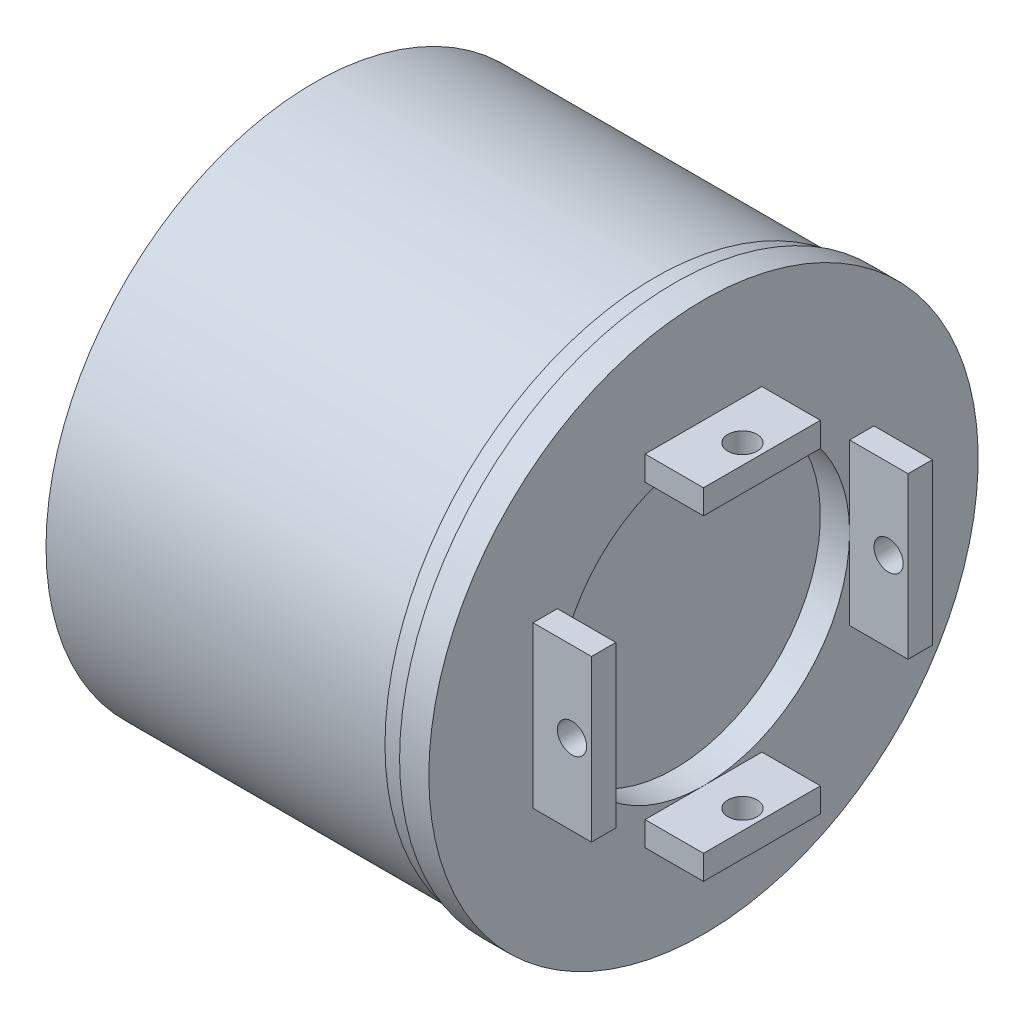
ISO-10303-21;
HEADER;
FILE_DESCRIPTION(('STEP AP214'),'2;1');
FILE_NAME('part.step','',(''),(''),'','','');
FILE_SCHEMA(('AUTOMOTIVE_DESIGN { 1 0 10303 214 1 1 1 1 }'));
ENDSEC;
DATA;
#1=APPLICATION_CONTEXT('core data for automotive mechanical design processes');
#2=APPLICATION_PROTOCOL_DEFINITION('international standard','automotive_design',2000,#1);
#3=PRODUCT_CONTEXT('',#1,'mechanical');
#4=PRODUCT('Part','Part','',(#3));
#5=PRODUCT_RELATED_PRODUCT_CATEGORY('part','',(#4));
#6=PRODUCT_DEFINITION_FORMATION('','',#4);
#7=PRODUCT_DEFINITION_CONTEXT('part definition',#1,'design');
#8=PRODUCT_DEFINITION('design','',#6,#7);
#9=PRODUCT_DEFINITION_SHAPE('','',#8);
#10=(LENGTH_UNIT() NAMED_UNIT(*) SI_UNIT(.MILLI.,.METRE.));
#11=(NAMED_UNIT(*) PLANE_ANGLE_UNIT() SI_UNIT($,.RADIAN.));
#12=(NAMED_UNIT(*) SI_UNIT($,.STERADIAN.) SOLID_ANGLE_UNIT());
#13=UNCERTAINTY_MEASURE_WITH_UNIT(LENGTH_MEASURE(1.E-05),#10,'distance_accuracy_value','');
#14=(GEOMETRIC_REPRESENTATION_CONTEXT(3) GLOBAL_UNCERTAINTY_ASSIGNED_CONTEXT((#13)) GLOBAL_UNIT_ASSIGNED_CONTEXT((#10,
#11,#12)) REPRESENTATION_CONTEXT('',''));
#15=CARTESIAN_POINT('',(0.,0.,0.));
#16=DIRECTION('',(0.,0.,1.));
#17=DIRECTION('',(1.,0.,0.));
#18=AXIS2_PLACEMENT_3D('',#15,#16,#17);
#19=CARTESIAN_POINT('',(41.,28.2,0.));
#20=DIRECTION('',(-1.,0.,0.));
#21=DIRECTION('',(0.,0.,1.));
#22=AXIS2_PLACEMENT_3D('',#19,#20,#21);
#23=PLANE('',#22);
#24=CARTESIAN_POINT('',(41.,0.,0.));
#25=DIRECTION('',(-1.,0.,0.));
#26=DIRECTION('',(0.,0.,1.));
#27=AXIS2_PLACEMENT_3D('',#24,#25,#26);
#28=CIRCLE('',#27,28.2);
#29=CARTESIAN_POINT('',(41.,0.,28.2));
#30=VERTEX_POINT('',#29);
#31=EDGE_CURVE('E333',#30,#30,#28,.T.);
#32=ORIENTED_EDGE('',*,*,#31,.F.);
#33=EDGE_LOOP('',(#32));
#34=FACE_BOUND('',#33,.T.);
#35=DIRECTION('',(0.,0.,1.));
#36=VECTOR('',#35,1.);
#37=CARTESIAN_POINT('',(41.,-15.,6.));
#38=LINE('',#37,#36);
#39=CARTESIAN_POINT('',(41.,-15.,-6.));
#40=VERTEX_POINT('',#39);
#41=CARTESIAN_POINT('',(41.,-15.,0.));
#42=VERTEX_POINT('',#41);
#43=EDGE_CURVE('E381',#40,#42,#38,.T.);
#44=ORIENTED_EDGE('',*,*,#43,.F.);
#45=DIRECTION('',(0.,1.,0.));
#46=VECTOR('',#45,1.);
#47=CARTESIAN_POINT('',(41.,-15.,-6.));
#48=LINE('',#47,#46);
#49=CARTESIAN_POINT('',(41.,-17.5,-6.));
#50=VERTEX_POINT('',#49);
#51=EDGE_CURVE('E184',#50,#40,#48,.T.);
#52=ORIENTED_EDGE('',*,*,#51,.F.);
#53=DIRECTION('',(0.,0.,-1.));
#54=VECTOR('',#53,1.);
#55=CARTESIAN_POINT('',(41.,-17.5,-6.));
#56=LINE('',#55,#54);
#57=CARTESIAN_POINT('',(41.,-17.5,6.));
#58=VERTEX_POINT('',#57);
#59=EDGE_CURVE('E62',#58,#50,#56,.T.);
#60=ORIENTED_EDGE('',*,*,#59,.F.);
#61=DIRECTION('',(0.,-1.,0.));
#62=VECTOR('',#61,1.);
#63=CARTESIAN_POINT('',(41.,-15.,6.));
#64=LINE('',#63,#62);
#65=CARTESIAN_POINT('',(41.,-15.,6.));
#66=VERTEX_POINT('',#65);
#67=EDGE_CURVE('E57',#66,#58,#64,.T.);
#68=ORIENTED_EDGE('',*,*,#67,.F.);
#69=EDGE_CURVE('E188',#42,#66,#38,.T.);
#70=ORIENTED_EDGE('',*,*,#69,.F.);
#71=CARTESIAN_POINT('',(41.,0.,0.));
#72=DIRECTION('',(-1.,0.,0.));
#73=DIRECTION('',(0.,0.,1.));
#74=AXIS2_PLACEMENT_3D('',#71,#72,#73);
#75=CIRCLE('',#74,15.);
#76=CARTESIAN_POINT('',(41.,0.,15.));
#77=VERTEX_POINT('',#76);
#78=EDGE_CURVE('E341',#42,#77,#75,.T.);
#79=ORIENTED_EDGE('',*,*,#78,.T.);
#80=DIRECTION('',(0.,1.,0.));
#81=VECTOR('',#80,1.);
#82=CARTESIAN_POINT('',(41.,8.25,15.));
#83=LINE('',#82,#81);
#84=CARTESIAN_POINT('',(41.,-8.25,15.));
#85=VERTEX_POINT('',#84);
#86=EDGE_CURVE('E192',#85,#77,#83,.T.);
#87=ORIENTED_EDGE('',*,*,#86,.F.);
#88=DIRECTION('',(0.,0.,-1.));
#89=VECTOR('',#88,1.);
#90=CARTESIAN_POINT('',(41.,-8.25,15.));
#91=LINE('',#90,#89);
#92=CARTESIAN_POINT('',(41.,-8.25,17.5));
#93=VERTEX_POINT('',#92);
#94=EDGE_CURVE('E202',#93,#85,#91,.T.);
#95=ORIENTED_EDGE('',*,*,#94,.F.);
#96=DIRECTION('',(0.,-1.,0.));
#97=VECTOR('',#96,1.);
#98=CARTESIAN_POINT('',(41.,8.25,17.5));
#99=LINE('',#98,#97);
#100=CARTESIAN_POINT('',(41.,8.25,17.5));
#101=VERTEX_POINT('',#100);
#102=EDGE_CURVE('E213',#101,#93,#99,.T.);
#103=ORIENTED_EDGE('',*,*,#102,.F.);
#104=DIRECTION('',(0.,0.,1.));
#105=VECTOR('',#104,1.);
#106=CARTESIAN_POINT('',(41.,8.25,15.));
#107=LINE('',#106,#105);
#108=CARTESIAN_POINT('',(41.,8.25,15.));
#109=VERTEX_POINT('',#108);
#110=EDGE_CURVE('E210',#109,#101,#107,.T.);
#111=ORIENTED_EDGE('',*,*,#110,.F.);
#112=EDGE_CURVE('E189',#77,#109,#83,.T.);
#113=ORIENTED_EDGE('',*,*,#112,.F.);
#114=CARTESIAN_POINT('',(41.,15.,0.));
#115=VERTEX_POINT('',#114);
#116=EDGE_CURVE('E762',#77,#115,#75,.T.);
#117=ORIENTED_EDGE('',*,*,#116,.T.);
#118=DIRECTION('',(0.,0.,-1.));
#119=VECTOR('',#118,1.);
#120=CARTESIAN_POINT('',(41.,15.,6.));
#121=LINE('',#120,#119);
#122=CARTESIAN_POINT('',(41.,15.,6.));
#123=VERTEX_POINT('',#122);
#124=EDGE_CURVE('E244',#123,#115,#121,.T.);
#125=ORIENTED_EDGE('',*,*,#124,.F.);
#126=DIRECTION('',(0.,-1.,0.));
#127=VECTOR('',#126,1.);
#128=CARTESIAN_POINT('',(41.,15.,6.));
#129=LINE('',#128,#127);
#130=CARTESIAN_POINT('',(41.,17.5,6.));
#131=VERTEX_POINT('',#130);
#132=EDGE_CURVE('E229',#131,#123,#129,.T.);
#133=ORIENTED_EDGE('',*,*,#132,.F.);
#134=DIRECTION('',(0.,0.,1.));
#135=VECTOR('',#134,1.);
#136=CARTESIAN_POINT('',(41.,17.5,-6.));
#137=LINE('',#136,#135);
#138=CARTESIAN_POINT('',(41.,17.5,-6.));
#139=VERTEX_POINT('',#138);
#140=EDGE_CURVE('E234',#139,#131,#137,.T.);
#141=ORIENTED_EDGE('',*,*,#140,.F.);
#142=DIRECTION('',(0.,1.,0.));
#143=VECTOR('',#142,1.);
#144=CARTESIAN_POINT('',(41.,15.,-6.));
#145=LINE('',#144,#143);
#146=CARTESIAN_POINT('',(41.,15.,-6.));
#147=VERTEX_POINT('',#146);
#148=EDGE_CURVE('E247',#147,#139,#145,.T.);
#149=ORIENTED_EDGE('',*,*,#148,.F.);
#150=EDGE_CURVE('E243',#115,#147,#121,.T.);
#151=ORIENTED_EDGE('',*,*,#150,.F.);
#152=CARTESIAN_POINT('',(41.,0.,-15.));
#153=VERTEX_POINT('',#152);
#154=EDGE_CURVE('E336',#115,#153,#75,.T.);
#155=ORIENTED_EDGE('',*,*,#154,.T.);
#156=DIRECTION('',(0.,-1.,0.));
#157=VECTOR('',#156,1.);
#158=CARTESIAN_POINT('',(41.,8.25,-15.));
#159=LINE('',#158,#157);
#160=CARTESIAN_POINT('',(41.,8.25,-15.));
#161=VERTEX_POINT('',#160);
#162=EDGE_CURVE('E50',#161,#153,#159,.T.);
#163=ORIENTED_EDGE('',*,*,#162,.F.);
#164=DIRECTION('',(0.,0.,1.));
#165=VECTOR('',#164,1.);
#166=CARTESIAN_POINT('',(41.,8.25,-15.));
#167=LINE('',#166,#165);
#168=CARTESIAN_POINT('',(41.,8.25,-17.5));
#169=VERTEX_POINT('',#168);
#170=EDGE_CURVE('E263',#169,#161,#167,.T.);
#171=ORIENTED_EDGE('',*,*,#170,.F.);
#172=DIRECTION('',(0.,1.,0.));
#173=VECTOR('',#172,1.);
#174=CARTESIAN_POINT('',(41.,8.25,-17.5));
#175=LINE('',#174,#173);
#176=CARTESIAN_POINT('',(41.,-8.25,-17.5));
#177=VERTEX_POINT('',#176);
#178=EDGE_CURVE('E268',#177,#169,#175,.T.);
#179=ORIENTED_EDGE('',*,*,#178,.F.);
#180=DIRECTION('',(0.,0.,-1.));
#181=VECTOR('',#180,1.);
#182=CARTESIAN_POINT('',(41.,-8.25,-15.));
#183=LINE('',#182,#181);
#184=CARTESIAN_POINT('',(41.,-8.25,-15.));
#185=VERTEX_POINT('',#184);
#186=EDGE_CURVE('E278',#185,#177,#183,.T.);
#187=ORIENTED_EDGE('',*,*,#186,.F.);
#188=EDGE_CURVE('E11',#153,#185,#159,.T.);
#189=ORIENTED_EDGE('',*,*,#188,.F.);
#190=EDGE_CURVE('E337',#153,#42,#75,.T.);
#191=ORIENTED_EDGE('',*,*,#190,.T.);
#192=EDGE_LOOP('',(#44,#52,#60,#68,#70,#79,#87,#95,#103,#111,#113,#117,#125,#133,#141,#149,#151,
#155,#163,#171,#179,#187,#189,#191));
#193=FACE_BOUND('',#192,.T.);
#194=ADVANCED_FACE('F39',(#34,#193),#23,.F.);
#195=CARTESIAN_POINT('',(1.5,16.5,0.));
#196=DIRECTION('',(1.,0.,0.));
#197=DIRECTION('',(0.,0.,-1.));
#198=AXIS2_PLACEMENT_3D('',#195,#196,#197);
#199=PLANE('',#198);
#200=CARTESIAN_POINT('',(1.5,0.,0.));
#201=DIRECTION('',(-1.,0.,0.));
#202=DIRECTION('',(0.,0.,1.));
#203=AXIS2_PLACEMENT_3D('',#200,#201,#202);
#204=CIRCLE('',#203,16.5);
#205=CARTESIAN_POINT('',(1.5,0.,16.5));
#206=VERTEX_POINT('',#205);
#207=EDGE_CURVE('E48',#206,#206,#204,.T.);
#208=ORIENTED_EDGE('',*,*,#207,.F.);
#209=EDGE_LOOP('',(#208));
#210=FACE_BOUND('',#209,.T.);
#211=CARTESIAN_POINT('',(1.5,0.,0.));
#212=DIRECTION('',(-1.,0.,0.));
#213=DIRECTION('',(0.,0.,1.));
#214=AXIS2_PLACEMENT_3D('',#211,#212,#213);
#215=CIRCLE('',#214,21.5);
#216=CARTESIAN_POINT('',(1.5,0.,21.5));
#217=VERTEX_POINT('',#216);
#218=EDGE_CURVE('E298',#217,#217,#215,.T.);
#219=ORIENTED_EDGE('',*,*,#218,.T.);
#220=EDGE_LOOP('',(#219));
#221=FACE_BOUND('',#220,.T.);
#222=ADVANCED_FACE('F41',(#210,#221),#199,.F.);
#223=CARTESIAN_POINT('',(-20.3653846153847,0.,0.));
#224=DIRECTION('',(-1.,0.,0.));
#225=DIRECTION('',(0.,0.,1.));
#226=AXIS2_PLACEMENT_3D('',#223,#224,#225);
#227=CYLINDRICAL_SURFACE('',#226,16.5);
#228=CARTESIAN_POINT('',(0.,0.,0.));
#229=DIRECTION('',(-1.,0.,0.));
#230=DIRECTION('',(0.,0.,1.));
#231=AXIS2_PLACEMENT_3D('',#228,#229,#230);
#232=CIRCLE('',#231,16.5);
#233=CARTESIAN_POINT('',(0.,0.,16.5));
#234=VERTEX_POINT('',#233);
#235=EDGE_CURVE('E350',#234,#234,#232,.T.);
#236=ORIENTED_EDGE('',*,*,#235,.F.);
#237=EDGE_LOOP('',(#236));
#238=FACE_BOUND('',#237,.T.);
#239=ORIENTED_EDGE('',*,*,#207,.T.);
#240=EDGE_LOOP('',(#239));
#241=FACE_BOUND('',#240,.T.);
#242=ADVANCED_FACE('F409',(#238,#241),#227,.T.);
#243=CARTESIAN_POINT('',(0.,16.5,0.));
#244=DIRECTION('',(1.,0.,0.));
#245=DIRECTION('',(0.,0.,-1.));
#246=AXIS2_PLACEMENT_3D('',#243,#244,#245);
#247=PLANE('',#246);
#248=CARTESIAN_POINT('',(0.,0.,0.));
#249=DIRECTION('',(-1.,0.,0.));
#250=DIRECTION('',(0.,0.,1.));
#251=AXIS2_PLACEMENT_3D('',#248,#249,#250);
#252=CIRCLE('',#251,16.4);
#253=CARTESIAN_POINT('',(0.,0.,16.4));
#254=VERTEX_POINT('',#253);
#255=EDGE_CURVE('E347',#254,#254,#252,.T.);
#256=ORIENTED_EDGE('',*,*,#255,.F.);
#257=EDGE_LOOP('',(#256));
#258=FACE_BOUND('',#257,.T.);
#259=ORIENTED_EDGE('',*,*,#235,.T.);
#260=EDGE_LOOP('',(#259));
#261=FACE_BOUND('',#260,.T.);
#262=ADVANCED_FACE('F431',(#258,#261),#247,.F.);
#263=CARTESIAN_POINT('',(-20.3653846153847,0.,0.));
#264=DIRECTION('',(-1.,0.,0.));
#265=DIRECTION('',(0.,0.,1.));
#266=AXIS2_PLACEMENT_3D('',#263,#264,#265);
#267=CYLINDRICAL_SURFACE('',#266,16.4);
#268=CARTESIAN_POINT('',(-2.2,0.,0.));
#269=DIRECTION('',(-1.,0.,0.));
#270=DIRECTION('',(0.,0.,1.));
#271=AXIS2_PLACEMENT_3D('',#268,#269,#270);
#272=CIRCLE('',#271,16.4);
#273=CARTESIAN_POINT('',(-2.2,0.,16.4));
#274=VERTEX_POINT('',#273);
#275=EDGE_CURVE('E344',#274,#274,#272,.T.);
#276=ORIENTED_EDGE('',*,*,#275,.F.);
#277=EDGE_LOOP('',(#276));
#278=FACE_BOUND('',#277,.T.);
#279=ORIENTED_EDGE('',*,*,#255,.T.);
#280=EDGE_LOOP('',(#279));
#281=FACE_BOUND('',#280,.T.);
#282=ADVANCED_FACE('F427',(#278,#281),#267,.T.);
#283=CARTESIAN_POINT('',(-2.2,16.4,0.));
#284=DIRECTION('',(1.,0.,0.));
#285=DIRECTION('',(0.,0.,-1.));
#286=AXIS2_PLACEMENT_3D('',#283,#284,#285);
#287=PLANE('',#286);
#288=ORIENTED_EDGE('',*,*,#275,.T.);
#289=EDGE_LOOP('',(#288));
#290=FACE_BOUND('',#289,.T.);
#291=ADVANCED_FACE('F423',(#290),#287,.F.);
#292=CARTESIAN_POINT('',(38.,15.,0.));
#293=DIRECTION('',(-1.,0.,0.));
#294=DIRECTION('',(0.,0.,1.));
#295=AXIS2_PLACEMENT_3D('',#292,#293,#294);
#296=PLANE('',#295);
#297=CARTESIAN_POINT('',(38.,0.,0.));
#298=DIRECTION('',(-1.,0.,0.));
#299=DIRECTION('',(0.,0.,1.));
#300=AXIS2_PLACEMENT_3D('',#297,#298,#299);
#301=CIRCLE('',#300,15.);
#302=CARTESIAN_POINT('',(38.,0.,15.));
#303=VERTEX_POINT('',#302);
#304=EDGE_CURVE('E340',#303,#303,#301,.T.);
#305=ORIENTED_EDGE('',*,*,#304,.F.);
#306=EDGE_LOOP('',(#305));
#307=FACE_BOUND('',#306,.T.);
#308=ADVANCED_FACE('F419',(#307),#296,.F.);
#309=CARTESIAN_POINT('',(-20.3653846153847,0.,0.));
#310=DIRECTION('',(-1.,0.,0.));
#311=DIRECTION('',(0.,0.,1.));
#312=AXIS2_PLACEMENT_3D('',#309,#310,#311);
#313=CYLINDRICAL_SURFACE('',#312,15.);
#314=ORIENTED_EDGE('',*,*,#190,.F.);
#315=ORIENTED_EDGE('',*,*,#154,.F.);
#316=ORIENTED_EDGE('',*,*,#116,.F.);
#317=ORIENTED_EDGE('',*,*,#78,.F.);
#318=EDGE_LOOP('',(#314,#315,#316,#317));
#319=FACE_BOUND('',#318,.T.);
#320=ORIENTED_EDGE('',*,*,#304,.T.);
#321=EDGE_LOOP('',(#320));
#322=FACE_BOUND('',#321,.T.);
#323=ADVANCED_FACE('F416',(#319,#322),#313,.F.);
#324=CARTESIAN_POINT('',(-20.3653846153847,0.,0.));
#325=DIRECTION('',(-1.,0.,0.));
#326=DIRECTION('',(0.,0.,1.));
#327=AXIS2_PLACEMENT_3D('',#324,#325,#326);
#328=CYLINDRICAL_SURFACE('',#327,28.2);
#329=CARTESIAN_POINT('',(38.,0.,0.));
#330=DIRECTION('',(-1.,0.,0.));
#331=DIRECTION('',(0.,0.,1.));
#332=AXIS2_PLACEMENT_3D('',#329,#330,#331);
#333=CIRCLE('',#332,28.2);
#334=CARTESIAN_POINT('',(38.,0.,28.2));
#335=VERTEX_POINT('',#334);
#336=EDGE_CURVE('E330',#335,#335,#333,.T.);
#337=ORIENTED_EDGE('',*,*,#336,.F.);
#338=EDGE_LOOP('',(#337));
#339=FACE_BOUND('',#338,.T.);
#340=ORIENTED_EDGE('',*,*,#31,.T.);
#341=EDGE_LOOP('',(#340));
#342=FACE_BOUND('',#341,.T.);
#343=ADVANCED_FACE('F414',(#339,#342),#328,.T.);
#344=CARTESIAN_POINT('',(38.,27.7,0.));
#345=DIRECTION('',(1.,0.,0.));
#346=DIRECTION('',(0.,0.,-1.));
#347=AXIS2_PLACEMENT_3D('',#344,#345,#346);
#348=PLANE('',#347);
#349=CARTESIAN_POINT('',(38.,0.,0.));
#350=DIRECTION('',(-1.,0.,0.));
#351=DIRECTION('',(0.,0.,1.));
#352=AXIS2_PLACEMENT_3D('',#349,#350,#351);
#353=CIRCLE('',#352,27.7);
#354=CARTESIAN_POINT('',(38.,0.,27.7));
#355=VERTEX_POINT('',#354);
#356=EDGE_CURVE('E327',#355,#355,#353,.T.);
#357=ORIENTED_EDGE('',*,*,#356,.F.);
#358=EDGE_LOOP('',(#357));
#359=FACE_BOUND('',#358,.T.);
#360=ORIENTED_EDGE('',*,*,#336,.T.);
#361=EDGE_LOOP('',(#360));
#362=FACE_BOUND('',#361,.T.);
#363=ADVANCED_FACE('F474',(#359,#362),#348,.F.);
#364=CARTESIAN_POINT('',(-20.3653846153847,0.,0.));
#365=DIRECTION('',(-1.,0.,0.));
#366=DIRECTION('',(0.,0.,1.));
#367=AXIS2_PLACEMENT_3D('',#364,#365,#366);
#368=CYLINDRICAL_SURFACE('',#367,27.7);
#369=CARTESIAN_POINT('',(36.,0.,0.));
#370=DIRECTION('',(-1.,0.,0.));
#371=DIRECTION('',(0.,0.,1.));
#372=AXIS2_PLACEMENT_3D('',#369,#370,#371);
#373=CIRCLE('',#372,27.7);
#374=CARTESIAN_POINT('',(36.,0.,27.7));
#375=VERTEX_POINT('',#374);
#376=EDGE_CURVE('E324',#375,#375,#373,.T.);
#377=ORIENTED_EDGE('',*,*,#376,.F.);
#378=EDGE_LOOP('',(#377));
#379=FACE_BOUND('',#378,.T.);
#380=ORIENTED_EDGE('',*,*,#356,.T.);
#381=EDGE_LOOP('',(#380));
#382=FACE_BOUND('',#381,.T.);
#383=ADVANCED_FACE('F468',(#379,#382),#368,.T.);
#384=CARTESIAN_POINT('',(36.,27.5,0.));
#385=DIRECTION('',(1.,0.,0.));
#386=DIRECTION('',(0.,0.,-1.));
#387=AXIS2_PLACEMENT_3D('',#384,#385,#386);
#388=PLANE('',#387);
#389=CARTESIAN_POINT('',(36.,0.,0.));
#390=DIRECTION('',(-1.,0.,0.));
#391=DIRECTION('',(0.,0.,1.));
#392=AXIS2_PLACEMENT_3D('',#389,#390,#391);
#393=CIRCLE('',#392,27.5);
#394=CARTESIAN_POINT('',(36.,0.,27.5));
#395=VERTEX_POINT('',#394);
#396=EDGE_CURVE('E321',#395,#395,#393,.T.);
#397=ORIENTED_EDGE('',*,*,#396,.F.);
#398=EDGE_LOOP('',(#397));
#399=FACE_BOUND('',#398,.T.);
#400=ORIENTED_EDGE('',*,*,#376,.T.);
#401=EDGE_LOOP('',(#400));
#402=FACE_BOUND('',#401,.T.);
#403=ADVANCED_FACE('F462',(#399,#402),#388,.F.);
#404=CARTESIAN_POINT('',(-20.3653846153847,0.,0.));
#405=DIRECTION('',(-1.,0.,0.));
#406=DIRECTION('',(0.,0.,1.));
#407=AXIS2_PLACEMENT_3D('',#404,#405,#406);
#408=CYLINDRICAL_SURFACE('',#407,27.5);
#409=CARTESIAN_POINT('',(1.,0.,0.));
#410=DIRECTION('',(-1.,0.,0.));
#411=DIRECTION('',(0.,0.,1.));
#412=AXIS2_PLACEMENT_3D('',#409,#410,#411);
#413=CIRCLE('',#412,27.5);
#414=CARTESIAN_POINT('',(1.,0.,27.5));
#415=VERTEX_POINT('',#414);
#416=EDGE_CURVE('E318',#415,#415,#413,.T.);
#417=ORIENTED_EDGE('',*,*,#416,.F.);
#418=EDGE_LOOP('',(#417));
#419=FACE_BOUND('',#418,.T.);
#420=ORIENTED_EDGE('',*,*,#396,.T.);
#421=EDGE_LOOP('',(#420));
#422=FACE_BOUND('',#421,.T.);
#423=ADVANCED_FACE('F455',(#419,#422),#408,.T.);
#424=CARTESIAN_POINT('',(1.,21.5,0.));
#425=DIRECTION('',(1.,0.,0.));
#426=DIRECTION('',(0.,0.,-1.));
#427=AXIS2_PLACEMENT_3D('',#424,#425,#426);
#428=PLANE('',#427);
#429=CARTESIAN_POINT('',(1.,25.,0.));
#430=DIRECTION('',(-1.,0.,0.));
#431=DIRECTION('',(0.,0.,1.));
#432=AXIS2_PLACEMENT_3D('',#429,#430,#431);
#433=CIRCLE('',#432,1.5);
#434=CARTESIAN_POINT('',(1.,25.,1.5));
#435=VERTEX_POINT('',#434);
#436=EDGE_CURVE('E299',#435,#435,#433,.T.);
#437=ORIENTED_EDGE('',*,*,#436,.F.);
#438=EDGE_LOOP('',(#437));
#439=FACE_BOUND('',#438,.T.);
#440=CARTESIAN_POINT('',(1.,-12.4999999999991,21.6506350946126));
#441=DIRECTION('',(-1.,0.,0.));
#442=DIRECTION('',(0.,0.,1.));
#443=AXIS2_PLACEMENT_3D('',#440,#441,#442);
#444=CIRCLE('',#443,1.50000000000138);
#445=CARTESIAN_POINT('',(1.,-12.4999999999991,23.1506350946139));
#446=VERTEX_POINT('',#445);
#447=EDGE_CURVE('E305',#446,#446,#444,.T.);
#448=ORIENTED_EDGE('',*,*,#447,.F.);
#449=EDGE_LOOP('',(#448));
#450=FACE_BOUND('',#449,.T.);
#451=CARTESIAN_POINT('',(1.,-12.5000000000009,-21.6506350946094));
#452=DIRECTION('',(-1.,0.,0.));
#453=DIRECTION('',(0.,0.,1.));
#454=AXIS2_PLACEMENT_3D('',#451,#452,#453);
#455=CIRCLE('',#454,1.50000000000203);
#456=CARTESIAN_POINT('',(1.,-12.5000000000009,-20.1506350946073));
#457=VERTEX_POINT('',#456);
#458=EDGE_CURVE('E294',#457,#457,#455,.T.);
#459=ORIENTED_EDGE('',*,*,#458,.F.);
#460=EDGE_LOOP('',(#459));
#461=FACE_BOUND('',#460,.T.);
#462=CARTESIAN_POINT('',(1.,0.,0.));
#463=DIRECTION('',(-1.,0.,0.));
#464=DIRECTION('',(0.,0.,1.));
#465=AXIS2_PLACEMENT_3D('',#462,#463,#464);
#466=CIRCLE('',#465,21.5);
#467=CARTESIAN_POINT('',(1.,0.,21.5));
#468=VERTEX_POINT('',#467);
#469=EDGE_CURVE('E315',#468,#468,#466,.T.);
#470=ORIENTED_EDGE('',*,*,#469,.F.);
#471=EDGE_LOOP('',(#470));
#472=FACE_BOUND('',#471,.T.);
#473=ORIENTED_EDGE('',*,*,#416,.T.);
#474=EDGE_LOOP('',(#473));
#475=FACE_BOUND('',#474,.T.);
#476=ADVANCED_FACE('F449',(#439,#450,#461,#472,#475),#428,.F.);
#477=CARTESIAN_POINT('',(-20.3653846153847,0.,0.));
#478=DIRECTION('',(-1.,0.,0.));
#479=DIRECTION('',(0.,0.,1.));
#480=AXIS2_PLACEMENT_3D('',#477,#478,#479);
#481=CYLINDRICAL_SURFACE('',#480,21.5);
#482=ORIENTED_EDGE('',*,*,#218,.F.);
#483=EDGE_LOOP('',(#482));
#484=FACE_BOUND('',#483,.T.);
#485=ORIENTED_EDGE('',*,*,#469,.T.);
#486=EDGE_LOOP('',(#485));
#487=FACE_BOUND('',#486,.T.);
#488=ADVANCED_FACE('F445',(#484,#487),#481,.F.);
#489=CARTESIAN_POINT('',(9.,-12.5000000000009,-21.6506350946094));
#490=DIRECTION('',(-1.,0.,0.));
#491=DIRECTION('',(0.,0.,1.));
#492=AXIS2_PLACEMENT_3D('',#489,#490,#491);
#493=CYLINDRICAL_SURFACE('',#492,1.50000000000203);
#494=CARTESIAN_POINT('',(9.,-12.5000000000009,-21.6506350946094));
#495=DIRECTION('',(-1.,0.,0.));
#496=DIRECTION('',(0.,0.,1.));
#497=AXIS2_PLACEMENT_3D('',#494,#495,#496);
#498=CIRCLE('',#497,1.50000000000203);
#499=CARTESIAN_POINT('',(9.,-12.5000000000009,-20.1506350946073));
#500=VERTEX_POINT('',#499);
#501=EDGE_CURVE('E308',#500,#500,#498,.T.);
#502=ORIENTED_EDGE('',*,*,#501,.F.);
#503=EDGE_LOOP('',(#502));
#504=FACE_BOUND('',#503,.T.);
#505=ORIENTED_EDGE('',*,*,#458,.T.);
#506=EDGE_LOOP('',(#505));
#507=FACE_BOUND('',#506,.T.);
#508=ADVANCED_FACE('F448',(#504,#507),#493,.F.);
#509=CARTESIAN_POINT('',(9.,-12.5000000000009,-21.6506350946094));
#510=DIRECTION('',(-1.,0.,0.));
#511=DIRECTION('',(0.,0.,1.));
#512=AXIS2_PLACEMENT_3D('',#509,#510,#511);
#513=PLANE('',#512);
#514=ORIENTED_EDGE('',*,*,#501,.T.);
#515=EDGE_LOOP('',(#514));
#516=FACE_BOUND('',#515,.T.);
#517=ADVANCED_FACE('F519',(#516),#513,.T.);
#518=CARTESIAN_POINT('',(9.,-12.4999999999991,21.6506350946126));
#519=DIRECTION('',(-1.,0.,0.));
#520=DIRECTION('',(0.,0.,1.));
#521=AXIS2_PLACEMENT_3D('',#518,#519,#520);
#522=CYLINDRICAL_SURFACE('',#521,1.50000000000138);
#523=CARTESIAN_POINT('',(9.,-12.4999999999991,21.6506350946126));
#524=DIRECTION('',(-1.,0.,0.));
#525=DIRECTION('',(0.,0.,1.));
#526=AXIS2_PLACEMENT_3D('',#523,#524,#525);
#527=CIRCLE('',#526,1.50000000000138);
#528=CARTESIAN_POINT('',(9.,-12.4999999999991,23.1506350946139));
#529=VERTEX_POINT('',#528);
#530=EDGE_CURVE('E302',#529,#529,#527,.T.);
#531=ORIENTED_EDGE('',*,*,#530,.F.);
#532=EDGE_LOOP('',(#531));
#533=FACE_BOUND('',#532,.T.);
#534=ORIENTED_EDGE('',*,*,#447,.T.);
#535=EDGE_LOOP('',(#534));
#536=FACE_BOUND('',#535,.T.);
#537=ADVANCED_FACE('F527',(#533,#536),#522,.F.);
#538=CARTESIAN_POINT('',(9.,-12.4999999999991,21.6506350946126));
#539=DIRECTION('',(-1.,0.,0.));
#540=DIRECTION('',(0.,0.,1.));
#541=AXIS2_PLACEMENT_3D('',#538,#539,#540);
#542=PLANE('',#541);
#543=ORIENTED_EDGE('',*,*,#530,.T.);
#544=EDGE_LOOP('',(#543));
#545=FACE_BOUND('',#544,.T.);
#546=ADVANCED_FACE('F535',(#545),#542,.T.);
#547=CARTESIAN_POINT('',(9.,25.,0.));
#548=DIRECTION('',(-1.,0.,0.));
#549=DIRECTION('',(0.,0.,1.));
#550=AXIS2_PLACEMENT_3D('',#547,#548,#549);
#551=CYLINDRICAL_SURFACE('',#550,1.5);
#552=CARTESIAN_POINT('',(9.,25.,0.));
#553=DIRECTION('',(-1.,0.,0.));
#554=DIRECTION('',(0.,0.,1.));
#555=AXIS2_PLACEMENT_3D('',#552,#553,#554);
#556=CIRCLE('',#555,1.5);
#557=CARTESIAN_POINT('',(9.,25.,1.5));
#558=VERTEX_POINT('',#557);
#559=EDGE_CURVE('E295',#558,#558,#556,.T.);
#560=ORIENTED_EDGE('',*,*,#559,.F.);
#561=EDGE_LOOP('',(#560));
#562=FACE_BOUND('',#561,.T.);
#563=ORIENTED_EDGE('',*,*,#436,.T.);
#564=EDGE_LOOP('',(#563));
#565=FACE_BOUND('',#564,.T.);
#566=ADVANCED_FACE('F543',(#562,#565),#551,.F.);
#567=CARTESIAN_POINT('',(9.,25.,0.));
#568=DIRECTION('',(-1.,0.,0.));
#569=DIRECTION('',(0.,0.,1.));
#570=AXIS2_PLACEMENT_3D('',#567,#568,#569);
#571=PLANE('',#570);
#572=ORIENTED_EDGE('',*,*,#559,.T.);
#573=EDGE_LOOP('',(#572));
#574=FACE_BOUND('',#573,.T.);
#575=ADVANCED_FACE('F551',(#574),#571,.T.);
#576=CARTESIAN_POINT('',(47.,8.25,-15.));
#577=DIRECTION('',(0.,-1.,0.));
#578=DIRECTION('',(0.,0.,-1.));
#579=AXIS2_PLACEMENT_3D('',#576,#577,#578);
#580=PLANE('',#579);
#581=ORIENTED_EDGE('',*,*,#170,.T.);
#582=DIRECTION('',(-1.,0.,0.));
#583=VECTOR('',#582,1.);
#584=CARTESIAN_POINT('',(47.,8.25,-15.));
#585=LINE('',#584,#583);
#586=CARTESIAN_POINT('',(47.,8.25,-15.));
#587=VERTEX_POINT('',#586);
#588=EDGE_CURVE('E291',#587,#161,#585,.T.);
#589=ORIENTED_EDGE('',*,*,#588,.F.);
#590=DIRECTION('',(0.,0.,1.));
#591=VECTOR('',#590,1.);
#592=CARTESIAN_POINT('',(47.,8.25,-15.));
#593=LINE('',#592,#591);
#594=CARTESIAN_POINT('',(47.,8.25,-17.5));
#595=VERTEX_POINT('',#594);
#596=EDGE_CURVE('E264',#595,#587,#593,.T.);
#597=ORIENTED_EDGE('',*,*,#596,.F.);
#598=DIRECTION('',(-1.,0.,0.));
#599=VECTOR('',#598,1.);
#600=CARTESIAN_POINT('',(47.,8.25,-17.5));
#601=LINE('',#600,#599);
#602=EDGE_CURVE('E274',#595,#169,#601,.T.);
#603=ORIENTED_EDGE('',*,*,#602,.T.);
#604=EDGE_LOOP('',(#581,#589,#597,#603));
#605=FACE_BOUND('',#604,.T.);
#606=ADVANCED_FACE('F559',(#605),#580,.F.);
#607=CARTESIAN_POINT('',(47.,8.25,-15.));
#608=DIRECTION('',(0.,0.,-1.));
#609=DIRECTION('',(-1.,0.,0.));
#610=AXIS2_PLACEMENT_3D('',#607,#608,#609);
#611=PLANE('',#610);
#612=CARTESIAN_POINT('',(45.,0.,-15.));
#613=DIRECTION('',(0.,0.,-1.));
#614=DIRECTION('',(-1.,0.,0.));
#615=AXIS2_PLACEMENT_3D('',#612,#613,#614);
#616=CIRCLE('',#615,1.5);
#617=CARTESIAN_POINT('',(43.5,0.,-15.));
#618=VERTEX_POINT('',#617);
#619=EDGE_CURVE('E375',#618,#618,#616,.T.);
#620=ORIENTED_EDGE('',*,*,#619,.T.);
#621=EDGE_LOOP('',(#620));
#622=FACE_BOUND('',#621,.T.);
#623=ORIENTED_EDGE('',*,*,#162,.T.);
#624=ORIENTED_EDGE('',*,*,#188,.T.);
#625=DIRECTION('',(-1.,0.,0.));
#626=VECTOR('',#625,1.);
#627=CARTESIAN_POINT('',(47.,-8.25,-15.));
#628=LINE('',#627,#626);
#629=CARTESIAN_POINT('',(47.,-8.25,-15.));
#630=VERTEX_POINT('',#629);
#631=EDGE_CURVE('E288',#630,#185,#628,.T.);
#632=ORIENTED_EDGE('',*,*,#631,.F.);
#633=DIRECTION('',(0.,-1.,0.));
#634=VECTOR('',#633,1.);
#635=CARTESIAN_POINT('',(47.,8.25,-15.));
#636=LINE('',#635,#634);
#637=EDGE_CURVE('E267',#587,#630,#636,.T.);
#638=ORIENTED_EDGE('',*,*,#637,.F.);
#639=ORIENTED_EDGE('',*,*,#588,.T.);
#640=EDGE_LOOP('',(#623,#624,#632,#638,#639));
#641=FACE_BOUND('',#640,.T.);
#642=ADVANCED_FACE('F567',(#622,#641),#611,.F.);
#643=CARTESIAN_POINT('',(47.,-8.25,-15.));
#644=DIRECTION('',(0.,1.,0.));
#645=DIRECTION('',(0.,0.,1.));
#646=AXIS2_PLACEMENT_3D('',#643,#644,#645);
#647=PLANE('',#646);
#648=ORIENTED_EDGE('',*,*,#186,.T.);
#649=DIRECTION('',(-1.,0.,0.));
#650=VECTOR('',#649,1.);
#651=CARTESIAN_POINT('',(47.,-8.25,-17.5));
#652=LINE('',#651,#650);
#653=CARTESIAN_POINT('',(47.,-8.25,-17.5));
#654=VERTEX_POINT('',#653);
#655=EDGE_CURVE('E285',#654,#177,#652,.T.);
#656=ORIENTED_EDGE('',*,*,#655,.F.);
#657=DIRECTION('',(0.,0.,-1.));
#658=VECTOR('',#657,1.);
#659=CARTESIAN_POINT('',(47.,-8.25,-15.));
#660=LINE('',#659,#658);
#661=EDGE_CURVE('E270',#630,#654,#660,.T.);
#662=ORIENTED_EDGE('',*,*,#661,.F.);
#663=ORIENTED_EDGE('',*,*,#631,.T.);
#664=EDGE_LOOP('',(#648,#656,#662,#663));
#665=FACE_BOUND('',#664,.T.);
#666=ADVANCED_FACE('F576',(#665),#647,.F.);
#667=CARTESIAN_POINT('',(47.,8.25,-17.5));
#668=DIRECTION('',(0.,0.,1.));
#669=DIRECTION('',(1.,0.,0.));
#670=AXIS2_PLACEMENT_3D('',#667,#668,#669);
#671=PLANE('',#670);
#672=CARTESIAN_POINT('',(45.,0.,-17.5));
#673=DIRECTION('',(0.,0.,1.));
#674=DIRECTION('',(1.,0.,0.));
#675=AXIS2_PLACEMENT_3D('',#672,#673,#674);
#676=CIRCLE('',#675,1.5);
#677=CARTESIAN_POINT('',(46.5,0.,-17.5));
#678=VERTEX_POINT('',#677);
#679=EDGE_CURVE('E361',#678,#678,#676,.T.);
#680=ORIENTED_EDGE('',*,*,#679,.T.);
#681=EDGE_LOOP('',(#680));
#682=FACE_BOUND('',#681,.T.);
#683=ORIENTED_EDGE('',*,*,#178,.T.);
#684=ORIENTED_EDGE('',*,*,#602,.F.);
#685=DIRECTION('',(0.,1.,0.));
#686=VECTOR('',#685,1.);
#687=CARTESIAN_POINT('',(47.,8.25,-17.5));
#688=LINE('',#687,#686);
#689=EDGE_CURVE('E272',#654,#595,#688,.T.);
#690=ORIENTED_EDGE('',*,*,#689,.F.);
#691=ORIENTED_EDGE('',*,*,#655,.T.);
#692=EDGE_LOOP('',(#683,#684,#690,#691));
#693=FACE_BOUND('',#692,.T.);
#694=ADVANCED_FACE('F585',(#682,#693),#671,.F.);
#695=CARTESIAN_POINT('',(47.,0.,0.));
#696=DIRECTION('',(-1.,0.,0.));
#697=DIRECTION('',(0.,0.,1.));
#698=AXIS2_PLACEMENT_3D('',#695,#696,#697);
#699=PLANE('',#698);
#700=ORIENTED_EDGE('',*,*,#596,.T.);
#701=ORIENTED_EDGE('',*,*,#637,.T.);
#702=ORIENTED_EDGE('',*,*,#661,.T.);
#703=ORIENTED_EDGE('',*,*,#689,.T.);
#704=EDGE_LOOP('',(#700,#701,#702,#703));
#705=FACE_BOUND('',#704,.T.);
#706=ADVANCED_FACE('F593',(#705),#699,.F.);
#707=CARTESIAN_POINT('',(47.,15.,6.));
#708=DIRECTION('',(0.,0.,-1.));
#709=DIRECTION('',(0.,1.,0.));
#710=AXIS2_PLACEMENT_3D('',#707,#708,#709);
#711=PLANE('',#710);
#712=ORIENTED_EDGE('',*,*,#132,.T.);
#713=DIRECTION('',(-1.,0.,0.));
#714=VECTOR('',#713,1.);
#715=CARTESIAN_POINT('',(47.,15.,6.));
#716=LINE('',#715,#714);
#717=CARTESIAN_POINT('',(47.,15.,6.));
#718=VERTEX_POINT('',#717);
#719=EDGE_CURVE('E260',#718,#123,#716,.T.);
#720=ORIENTED_EDGE('',*,*,#719,.F.);
#721=DIRECTION('',(0.,-1.,0.));
#722=VECTOR('',#721,1.);
#723=CARTESIAN_POINT('',(47.,15.,6.));
#724=LINE('',#723,#722);
#725=CARTESIAN_POINT('',(47.,17.5,6.));
#726=VERTEX_POINT('',#725);
#727=EDGE_CURVE('E230',#726,#718,#724,.T.);
#728=ORIENTED_EDGE('',*,*,#727,.F.);
#729=DIRECTION('',(-1.,0.,0.));
#730=VECTOR('',#729,1.);
#731=CARTESIAN_POINT('',(47.,17.5,6.));
#732=LINE('',#731,#730);
#733=EDGE_CURVE('E240',#726,#131,#732,.T.);
#734=ORIENTED_EDGE('',*,*,#733,.T.);
#735=EDGE_LOOP('',(#712,#720,#728,#734));
#736=FACE_BOUND('',#735,.T.);
#737=ADVANCED_FACE('F601',(#736),#711,.F.);
#738=CARTESIAN_POINT('',(47.,15.,6.));
#739=DIRECTION('',(0.,1.,0.));
#740=DIRECTION('',(0.,0.,1.));
#741=AXIS2_PLACEMENT_3D('',#738,#739,#740);
#742=PLANE('',#741);
#743=CARTESIAN_POINT('',(45.,15.,0.));
#744=DIRECTION('',(0.,1.,0.));
#745=DIRECTION('',(0.,0.,1.));
#746=AXIS2_PLACEMENT_3D('',#743,#744,#745);
#747=CIRCLE('',#746,1.5);
#748=CARTESIAN_POINT('',(45.,15.,1.49999999999995));
#749=VERTEX_POINT('',#748);
#750=EDGE_CURVE('E357',#749,#749,#747,.T.);
#751=ORIENTED_EDGE('',*,*,#750,.T.);
#752=EDGE_LOOP('',(#751));
#753=FACE_BOUND('',#752,.T.);
#754=ORIENTED_EDGE('',*,*,#124,.T.);
#755=ORIENTED_EDGE('',*,*,#150,.T.);
#756=DIRECTION('',(-1.,0.,0.));
#757=VECTOR('',#756,1.);
#758=CARTESIAN_POINT('',(47.,15.,-6.));
#759=LINE('',#758,#757);
#760=CARTESIAN_POINT('',(47.,15.,-6.));
#761=VERTEX_POINT('',#760);
#762=EDGE_CURVE('E257',#761,#147,#759,.T.);
#763=ORIENTED_EDGE('',*,*,#762,.F.);
#764=DIRECTION('',(0.,0.,-1.));
#765=VECTOR('',#764,1.);
#766=CARTESIAN_POINT('',(47.,15.,6.));
#767=LINE('',#766,#765);
#768=EDGE_CURVE('E233',#718,#761,#767,.T.);
#769=ORIENTED_EDGE('',*,*,#768,.F.);
#770=ORIENTED_EDGE('',*,*,#719,.T.);
#771=EDGE_LOOP('',(#754,#755,#763,#769,#770));
#772=FACE_BOUND('',#771,.T.);
#773=ADVANCED_FACE('F609',(#753,#772),#742,.F.);
#774=CARTESIAN_POINT('',(47.,15.,-6.));
#775=DIRECTION('',(0.,0.,1.));
#776=DIRECTION('',(1.,0.,0.));
#777=AXIS2_PLACEMENT_3D('',#774,#775,#776);
#778=PLANE('',#777);
#779=ORIENTED_EDGE('',*,*,#148,.T.);
#780=DIRECTION('',(-1.,0.,0.));
#781=VECTOR('',#780,1.);
#782=CARTESIAN_POINT('',(47.,17.5,-6.));
#783=LINE('',#782,#781);
#784=CARTESIAN_POINT('',(47.,17.5,-6.));
#785=VERTEX_POINT('',#784);
#786=EDGE_CURVE('E254',#785,#139,#783,.T.);
#787=ORIENTED_EDGE('',*,*,#786,.F.);
#788=DIRECTION('',(0.,1.,0.));
#789=VECTOR('',#788,1.);
#790=CARTESIAN_POINT('',(47.,15.,-6.));
#791=LINE('',#790,#789);
#792=EDGE_CURVE('E236',#761,#785,#791,.T.);
#793=ORIENTED_EDGE('',*,*,#792,.F.);
#794=ORIENTED_EDGE('',*,*,#762,.T.);
#795=EDGE_LOOP('',(#779,#787,#793,#794));
#796=FACE_BOUND('',#795,.T.);
#797=ADVANCED_FACE('F618',(#796),#778,.F.);
#798=CARTESIAN_POINT('',(47.,17.5,-6.));
#799=DIRECTION('',(0.,-1.,0.));
#800=DIRECTION('',(0.,0.,-1.));
#801=AXIS2_PLACEMENT_3D('',#798,#799,#800);
#802=PLANE('',#801);
#803=CARTESIAN_POINT('',(45.,17.5,0.));
#804=DIRECTION('',(0.,-1.,0.));
#805=DIRECTION('',(0.,0.,-1.));
#806=AXIS2_PLACEMENT_3D('',#803,#804,#805);
#807=CIRCLE('',#806,1.5);
#808=CARTESIAN_POINT('',(45.,17.5,-1.50000000000007));
#809=VERTEX_POINT('',#808);
#810=EDGE_CURVE('E364',#809,#809,#807,.T.);
#811=ORIENTED_EDGE('',*,*,#810,.T.);
#812=EDGE_LOOP('',(#811));
#813=FACE_BOUND('',#812,.T.);
#814=ORIENTED_EDGE('',*,*,#140,.T.);
#815=ORIENTED_EDGE('',*,*,#733,.F.);
#816=DIRECTION('',(0.,0.,1.));
#817=VECTOR('',#816,1.);
#818=CARTESIAN_POINT('',(47.,17.5,-6.));
#819=LINE('',#818,#817);
#820=EDGE_CURVE('E238',#785,#726,#819,.T.);
#821=ORIENTED_EDGE('',*,*,#820,.F.);
#822=ORIENTED_EDGE('',*,*,#786,.T.);
#823=EDGE_LOOP('',(#814,#815,#821,#822));
#824=FACE_BOUND('',#823,.T.);
#825=ADVANCED_FACE('F626',(#813,#824),#802,.F.);
#826=CARTESIAN_POINT('',(47.,0.,0.));
#827=DIRECTION('',(1.,0.,0.));
#828=DIRECTION('',(0.,0.,-1.));
#829=AXIS2_PLACEMENT_3D('',#826,#827,#828);
#830=PLANE('',#829);
#831=ORIENTED_EDGE('',*,*,#727,.T.);
#832=ORIENTED_EDGE('',*,*,#768,.T.);
#833=ORIENTED_EDGE('',*,*,#792,.T.);
#834=ORIENTED_EDGE('',*,*,#820,.T.);
#835=EDGE_LOOP('',(#831,#832,#833,#834));
#836=FACE_BOUND('',#835,.T.);
#837=ADVANCED_FACE('F634',(#836),#830,.T.);
#838=CARTESIAN_POINT('',(47.,8.25,15.));
#839=DIRECTION('',(0.,0.,1.));
#840=DIRECTION('',(1.,0.,0.));
#841=AXIS2_PLACEMENT_3D('',#838,#839,#840);
#842=PLANE('',#841);
#843=CARTESIAN_POINT('',(45.,0.,15.));
#844=DIRECTION('',(0.,0.,1.));
#845=DIRECTION('',(1.,0.,0.));
#846=AXIS2_PLACEMENT_3D('',#843,#844,#845);
#847=CIRCLE('',#846,1.5);
#848=CARTESIAN_POINT('',(46.5,0.,15.));
#849=VERTEX_POINT('',#848);
#850=EDGE_CURVE('E356',#849,#849,#847,.T.);
#851=ORIENTED_EDGE('',*,*,#850,.T.);
#852=EDGE_LOOP('',(#851));
#853=FACE_BOUND('',#852,.T.);
#854=ORIENTED_EDGE('',*,*,#86,.T.);
#855=ORIENTED_EDGE('',*,*,#112,.T.);
#856=DIRECTION('',(-1.,0.,0.));
#857=VECTOR('',#856,1.);
#858=CARTESIAN_POINT('',(47.,8.25,15.));
#859=LINE('',#858,#857);
#860=CARTESIAN_POINT('',(47.,8.25,15.));
#861=VERTEX_POINT('',#860);
#862=EDGE_CURVE('E226',#861,#109,#859,.T.);
#863=ORIENTED_EDGE('',*,*,#862,.F.);
#864=DIRECTION('',(0.,1.,0.));
#865=VECTOR('',#864,1.);
#866=CARTESIAN_POINT('',(47.,8.25,15.));
#867=LINE('',#866,#865);
#868=CARTESIAN_POINT('',(47.,-8.25,15.));
#869=VERTEX_POINT('',#868);
#870=EDGE_CURVE('E198',#869,#861,#867,.T.);
#871=ORIENTED_EDGE('',*,*,#870,.F.);
#872=DIRECTION('',(-1.,0.,0.));
#873=VECTOR('',#872,1.);
#874=CARTESIAN_POINT('',(47.,-8.25,15.));
#875=LINE('',#874,#873);
#876=EDGE_CURVE('E207',#869,#85,#875,.T.);
#877=ORIENTED_EDGE('',*,*,#876,.T.);
#878=EDGE_LOOP('',(#854,#855,#863,#871,#877));
#879=FACE_BOUND('',#878,.T.);
#880=ADVANCED_FACE('F642',(#853,#879),#842,.F.);
#881=CARTESIAN_POINT('',(47.,8.25,15.));
#882=DIRECTION('',(0.,-1.,0.));
#883=DIRECTION('',(0.,0.,-1.));
#884=AXIS2_PLACEMENT_3D('',#881,#882,#883);
#885=PLANE('',#884);
#886=ORIENTED_EDGE('',*,*,#110,.T.);
#887=DIRECTION('',(-1.,0.,0.));
#888=VECTOR('',#887,1.);
#889=CARTESIAN_POINT('',(47.,8.25,17.5));
#890=LINE('',#889,#888);
#891=CARTESIAN_POINT('',(47.,8.25,17.5));
#892=VERTEX_POINT('',#891);
#893=EDGE_CURVE('E223',#892,#101,#890,.T.);
#894=ORIENTED_EDGE('',*,*,#893,.F.);
#895=DIRECTION('',(0.,0.,1.));
#896=VECTOR('',#895,1.);
#897=CARTESIAN_POINT('',(47.,8.25,15.));
#898=LINE('',#897,#896);
#899=EDGE_CURVE('E201',#861,#892,#898,.T.);
#900=ORIENTED_EDGE('',*,*,#899,.F.);
#901=ORIENTED_EDGE('',*,*,#862,.T.);
#902=EDGE_LOOP('',(#886,#894,#900,#901));
#903=FACE_BOUND('',#902,.T.);
#904=ADVANCED_FACE('F650',(#903),#885,.F.);
#905=CARTESIAN_POINT('',(47.,8.25,17.5));
#906=DIRECTION('',(0.,0.,-1.));
#907=DIRECTION('',(-1.,0.,0.));
#908=AXIS2_PLACEMENT_3D('',#905,#906,#907);
#909=PLANE('',#908);
#910=CARTESIAN_POINT('',(45.,0.,17.5));
#911=DIRECTION('',(0.,0.,-1.));
#912=DIRECTION('',(-1.,0.,0.));
#913=AXIS2_PLACEMENT_3D('',#910,#911,#912);
#914=CIRCLE('',#913,1.5);
#915=CARTESIAN_POINT('',(43.5,0.,17.5));
#916=VERTEX_POINT('',#915);
#917=EDGE_CURVE('E354',#916,#916,#914,.T.);
#918=ORIENTED_EDGE('',*,*,#917,.T.);
#919=EDGE_LOOP('',(#918));
#920=FACE_BOUND('',#919,.T.);
#921=ORIENTED_EDGE('',*,*,#102,.T.);
#922=DIRECTION('',(-1.,0.,0.));
#923=VECTOR('',#922,1.);
#924=CARTESIAN_POINT('',(47.,-8.25,17.5));
#925=LINE('',#924,#923);
#926=CARTESIAN_POINT('',(47.,-8.25,17.5));
#927=VERTEX_POINT('',#926);
#928=EDGE_CURVE('E220',#927,#93,#925,.T.);
#929=ORIENTED_EDGE('',*,*,#928,.F.);
#930=DIRECTION('',(0.,-1.,0.));
#931=VECTOR('',#930,1.);
#932=CARTESIAN_POINT('',(47.,8.25,17.5));
#933=LINE('',#932,#931);
#934=EDGE_CURVE('E204',#892,#927,#933,.T.);
#935=ORIENTED_EDGE('',*,*,#934,.F.);
#936=ORIENTED_EDGE('',*,*,#893,.T.);
#937=EDGE_LOOP('',(#921,#929,#935,#936));
#938=FACE_BOUND('',#937,.T.);
#939=ADVANCED_FACE('F658',(#920,#938),#909,.F.);
#940=CARTESIAN_POINT('',(47.,-8.25,15.));
#941=DIRECTION('',(0.,1.,0.));
#942=DIRECTION('',(0.,0.,1.));
#943=AXIS2_PLACEMENT_3D('',#940,#941,#942);
#944=PLANE('',#943);
#945=ORIENTED_EDGE('',*,*,#94,.T.);
#946=ORIENTED_EDGE('',*,*,#876,.F.);
#947=DIRECTION('',(0.,0.,-1.));
#948=VECTOR('',#947,1.);
#949=CARTESIAN_POINT('',(47.,-8.25,15.));
#950=LINE('',#949,#948);
#951=EDGE_CURVE('E206',#927,#869,#950,.T.);
#952=ORIENTED_EDGE('',*,*,#951,.F.);
#953=ORIENTED_EDGE('',*,*,#928,.T.);
#954=EDGE_LOOP('',(#945,#946,#952,#953));
#955=FACE_BOUND('',#954,.T.);
#956=ADVANCED_FACE('F666',(#955),#944,.F.);
#957=CARTESIAN_POINT('',(47.,0.,0.));
#958=DIRECTION('',(-1.,0.,0.));
#959=DIRECTION('',(0.,0.,1.));
#960=AXIS2_PLACEMENT_3D('',#957,#958,#959);
#961=PLANE('',#960);
#962=ORIENTED_EDGE('',*,*,#870,.T.);
#963=ORIENTED_EDGE('',*,*,#899,.T.);
#964=ORIENTED_EDGE('',*,*,#934,.T.);
#965=ORIENTED_EDGE('',*,*,#951,.T.);
#966=EDGE_LOOP('',(#962,#963,#964,#965));
#967=FACE_BOUND('',#966,.T.);
#968=ADVANCED_FACE('F673',(#967),#961,.F.);
#969=CARTESIAN_POINT('',(47.,-15.,6.));
#970=DIRECTION('',(0.,-1.,0.));
#971=DIRECTION('',(0.,0.,-1.));
#972=AXIS2_PLACEMENT_3D('',#969,#970,#971);
#973=PLANE('',#972);
#974=CARTESIAN_POINT('',(45.,-15.,0.));
#975=DIRECTION('',(0.,-1.,0.));
#976=DIRECTION('',(0.,0.,-1.));
#977=AXIS2_PLACEMENT_3D('',#974,#975,#976);
#978=CIRCLE('',#977,1.5);
#979=CARTESIAN_POINT('',(45.,-15.,-1.49999999999995));
#980=VERTEX_POINT('',#979);
#981=EDGE_CURVE('E369',#980,#980,#978,.T.);
#982=ORIENTED_EDGE('',*,*,#981,.T.);
#983=EDGE_LOOP('',(#982));
#984=FACE_BOUND('',#983,.T.);
#985=ORIENTED_EDGE('',*,*,#43,.T.);
#986=ORIENTED_EDGE('',*,*,#69,.T.);
#987=DIRECTION('',(-1.,0.,0.));
#988=VECTOR('',#987,1.);
#989=CARTESIAN_POINT('',(47.,-15.,6.));
#990=LINE('',#989,#988);
#991=CARTESIAN_POINT('',(47.,-15.,6.));
#992=VERTEX_POINT('',#991);
#993=EDGE_CURVE('E169',#992,#66,#990,.T.);
#994=ORIENTED_EDGE('',*,*,#993,.F.);
#995=DIRECTION('',(0.,0.,1.));
#996=VECTOR('',#995,1.);
#997=CARTESIAN_POINT('',(47.,-15.,6.));
#998=LINE('',#997,#996);
#999=CARTESIAN_POINT('',(47.,-15.,-6.));
#1000=VERTEX_POINT('',#999);
#1001=EDGE_CURVE('E175',#1000,#992,#998,.T.);
#1002=ORIENTED_EDGE('',*,*,#1001,.F.);
#1003=DIRECTION('',(-1.,0.,0.));
#1004=VECTOR('',#1003,1.);
#1005=CARTESIAN_POINT('',(47.,-15.,-6.));
#1006=LINE('',#1005,#1004);
#1007=EDGE_CURVE('E380',#1000,#40,#1006,.T.);
#1008=ORIENTED_EDGE('',*,*,#1007,.T.);
#1009=EDGE_LOOP('',(#985,#986,#994,#1002,#1008));
#1010=FACE_BOUND('',#1009,.T.);
#1011=ADVANCED_FACE('F187',(#984,#1010),#973,.F.);
#1012=CARTESIAN_POINT('',(47.,-15.,6.));
#1013=DIRECTION('',(0.,0.,-1.));
#1014=DIRECTION('',(0.,1.,0.));
#1015=AXIS2_PLACEMENT_3D('',#1012,#1013,#1014);
#1016=PLANE('',#1015);
#1017=ORIENTED_EDGE('',*,*,#67,.T.);
#1018=DIRECTION('',(-1.,0.,0.));
#1019=VECTOR('',#1018,1.);
#1020=CARTESIAN_POINT('',(47.,-17.5,6.));
#1021=LINE('',#1020,#1019);
#1022=CARTESIAN_POINT('',(47.,-17.5,6.));
#1023=VERTEX_POINT('',#1022);
#1024=EDGE_CURVE('E171',#1023,#58,#1021,.T.);
#1025=ORIENTED_EDGE('',*,*,#1024,.F.);
#1026=DIRECTION('',(0.,-1.,0.));
#1027=VECTOR('',#1026,1.);
#1028=CARTESIAN_POINT('',(47.,-15.,6.));
#1029=LINE('',#1028,#1027);
#1030=EDGE_CURVE('E165',#992,#1023,#1029,.T.);
#1031=ORIENTED_EDGE('',*,*,#1030,.F.);
#1032=ORIENTED_EDGE('',*,*,#993,.T.);
#1033=EDGE_LOOP('',(#1017,#1025,#1031,#1032));
#1034=FACE_BOUND('',#1033,.T.);
#1035=ADVANCED_FACE('F167',(#1034),#1016,.F.);
#1036=CARTESIAN_POINT('',(47.,-17.5,-6.));
#1037=DIRECTION('',(0.,1.,0.));
#1038=DIRECTION('',(0.,0.,1.));
#1039=AXIS2_PLACEMENT_3D('',#1036,#1037,#1038);
#1040=PLANE('',#1039);
#1041=CARTESIAN_POINT('',(45.,-17.5,0.));
#1042=DIRECTION('',(0.,1.,0.));
#1043=DIRECTION('',(0.,0.,1.));
#1044=AXIS2_PLACEMENT_3D('',#1041,#1042,#1043);
#1045=CIRCLE('',#1044,1.5);
#1046=CARTESIAN_POINT('',(45.,-17.5,1.50000000000007));
#1047=VERTEX_POINT('',#1046);
#1048=EDGE_CURVE('E43',#1047,#1047,#1045,.T.);
#1049=ORIENTED_EDGE('',*,*,#1048,.T.);
#1050=EDGE_LOOP('',(#1049));
#1051=FACE_BOUND('',#1050,.T.);
#1052=ORIENTED_EDGE('',*,*,#59,.T.);
#1053=DIRECTION('',(-1.,0.,0.));
#1054=VECTOR('',#1053,1.);
#1055=CARTESIAN_POINT('',(47.,-17.5,-6.));
#1056=LINE('',#1055,#1054);
#1057=CARTESIAN_POINT('',(47.,-17.5,-6.));
#1058=VERTEX_POINT('',#1057);
#1059=EDGE_CURVE('E194',#1058,#50,#1056,.T.);
#1060=ORIENTED_EDGE('',*,*,#1059,.F.);
#1061=DIRECTION('',(0.,0.,-1.));
#1062=VECTOR('',#1061,1.);
#1063=CARTESIAN_POINT('',(47.,-17.5,-6.));
#1064=LINE('',#1063,#1062);
#1065=EDGE_CURVE('E174',#1023,#1058,#1064,.T.);
#1066=ORIENTED_EDGE('',*,*,#1065,.F.);
#1067=ORIENTED_EDGE('',*,*,#1024,.T.);
#1068=EDGE_LOOP('',(#1052,#1060,#1066,#1067));
#1069=FACE_BOUND('',#1068,.T.);
#1070=ADVANCED_FACE('F392',(#1051,#1069),#1040,.F.);
#1071=CARTESIAN_POINT('',(47.,-15.,-6.));
#1072=DIRECTION('',(0.,0.,1.));
#1073=DIRECTION('',(1.,0.,0.));
#1074=AXIS2_PLACEMENT_3D('',#1071,#1072,#1073);
#1075=PLANE('',#1074);
#1076=ORIENTED_EDGE('',*,*,#51,.T.);
#1077=ORIENTED_EDGE('',*,*,#1007,.F.);
#1078=DIRECTION('',(0.,1.,0.));
#1079=VECTOR('',#1078,1.);
#1080=CARTESIAN_POINT('',(47.,-15.,-6.));
#1081=LINE('',#1080,#1079);
#1082=EDGE_CURVE('E180',#1058,#1000,#1081,.T.);
#1083=ORIENTED_EDGE('',*,*,#1082,.F.);
#1084=ORIENTED_EDGE('',*,*,#1059,.T.);
#1085=EDGE_LOOP('',(#1076,#1077,#1083,#1084));
#1086=FACE_BOUND('',#1085,.T.);
#1087=ADVANCED_FACE('F390',(#1086),#1075,.F.);
#1088=CARTESIAN_POINT('',(47.,0.,0.));
#1089=DIRECTION('',(-1.,0.,0.));
#1090=DIRECTION('',(0.,0.,1.));
#1091=AXIS2_PLACEMENT_3D('',#1088,#1089,#1090);
#1092=PLANE('',#1091);
#1093=ORIENTED_EDGE('',*,*,#1001,.T.);
#1094=ORIENTED_EDGE('',*,*,#1030,.T.);
#1095=ORIENTED_EDGE('',*,*,#1065,.T.);
#1096=ORIENTED_EDGE('',*,*,#1082,.T.);
#1097=EDGE_LOOP('',(#1093,#1094,#1095,#1096));
#1098=FACE_BOUND('',#1097,.T.);
#1099=ADVANCED_FACE('F178',(#1098),#1092,.F.);
#1100=CARTESIAN_POINT('',(45.,0.,-50.));
#1101=DIRECTION('',(0.,0.,1.));
#1102=DIRECTION('',(1.,0.,0.));
#1103=AXIS2_PLACEMENT_3D('',#1100,#1101,#1102);
#1104=CYLINDRICAL_SURFACE('',#1103,1.5);
#1105=ORIENTED_EDGE('',*,*,#917,.F.);
#1106=EDGE_LOOP('',(#1105));
#1107=FACE_BOUND('',#1106,.T.);
#1108=ORIENTED_EDGE('',*,*,#850,.F.);
#1109=EDGE_LOOP('',(#1108));
#1110=FACE_BOUND('',#1109,.T.);
#1111=ADVANCED_FACE('F706',(#1107,#1110),#1104,.F.);
#1112=ORIENTED_EDGE('',*,*,#679,.F.);
#1113=EDGE_LOOP('',(#1112));
#1114=FACE_BOUND('',#1113,.T.);
#1115=ORIENTED_EDGE('',*,*,#619,.F.);
#1116=EDGE_LOOP('',(#1115));
#1117=FACE_BOUND('',#1116,.T.);
#1118=ADVANCED_FACE('F715',(#1114,#1117),#1104,.F.);
#1119=CARTESIAN_POINT('',(45.,-50.,1.74574066942157E-13));
#1120=DIRECTION('',(0.,1.,0.));
#1121=DIRECTION('',(0.,0.,1.));
#1122=AXIS2_PLACEMENT_3D('',#1119,#1120,#1121);
#1123=CYLINDRICAL_SURFACE('',#1122,1.5);
#1124=ORIENTED_EDGE('',*,*,#1048,.F.);
#1125=EDGE_LOOP('',(#1124));
#1126=FACE_BOUND('',#1125,.T.);
#1127=ORIENTED_EDGE('',*,*,#981,.F.);
#1128=EDGE_LOOP('',(#1127));
#1129=FACE_BOUND('',#1128,.T.);
#1130=ADVANCED_FACE('F721',(#1126,#1129),#1123,.F.);
#1131=ORIENTED_EDGE('',*,*,#810,.F.);
#1132=EDGE_LOOP('',(#1131));
#1133=FACE_BOUND('',#1132,.T.);
#1134=ORIENTED_EDGE('',*,*,#750,.F.);
#1135=EDGE_LOOP('',(#1134));
#1136=FACE_BOUND('',#1135,.T.);
#1137=ADVANCED_FACE('F728',(#1133,#1136),#1123,.F.);
#1138=CLOSED_SHELL('',(#194,#222,#242,#262,#282,#291,#308,#323,#343,#363,#383,#403,#423,#476,
#488,#508,#517,#537,#546,#566,#575,#606,#642,#666,#694,#706,#737,#773,#797,#825,#837,#880,#904,
#939,#956,#968,#1011,#1035,#1070,#1087,#1099,#1111,#1118,#1130,#1137));
#1139=MANIFOLD_SOLID_BREP('B2',#1138);
#1140=ADVANCED_BREP_SHAPE_REPRESENTATION('',(#18,#1139),#14);
#1141=SHAPE_DEFINITION_REPRESENTATION(#9,#1140);
ENDSEC;
END-ISO-10303-21;
